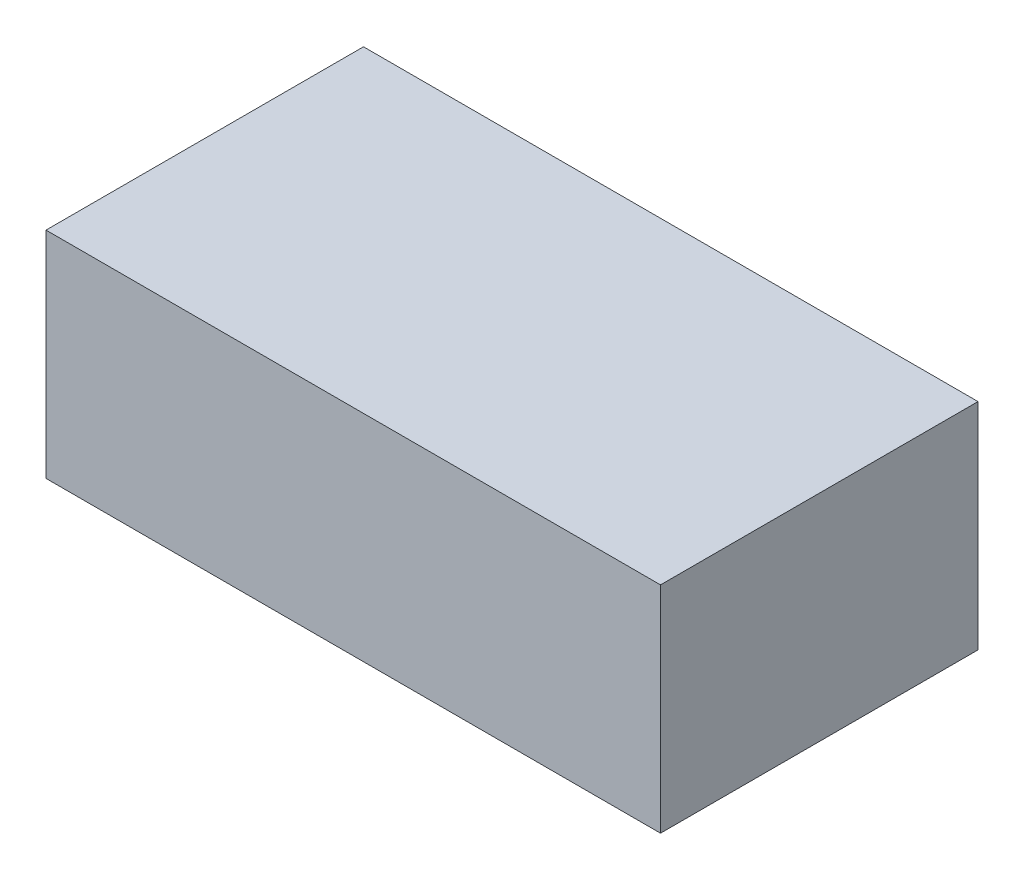
ISO-10303-21;
HEADER;
FILE_DESCRIPTION(('STEP AP214'),'2;1');
FILE_NAME('part.step','',(''),(''),'','','');
FILE_SCHEMA(('AUTOMOTIVE_DESIGN { 1 0 10303 214 1 1 1 1 }'));
ENDSEC;
DATA;
#1=APPLICATION_CONTEXT('core data for automotive mechanical design processes');
#2=APPLICATION_PROTOCOL_DEFINITION('international standard','automotive_design',2000,#1);
#3=PRODUCT_CONTEXT('',#1,'mechanical');
#4=PRODUCT('Part','Part','',(#3));
#5=PRODUCT_RELATED_PRODUCT_CATEGORY('part','',(#4));
#6=PRODUCT_DEFINITION_FORMATION('','',#4);
#7=PRODUCT_DEFINITION_CONTEXT('part definition',#1,'design');
#8=PRODUCT_DEFINITION('design','',#6,#7);
#9=PRODUCT_DEFINITION_SHAPE('','',#8);
#10=(LENGTH_UNIT() NAMED_UNIT(*) SI_UNIT(.MILLI.,.METRE.));
#11=(NAMED_UNIT(*) PLANE_ANGLE_UNIT() SI_UNIT($,.RADIAN.));
#12=(NAMED_UNIT(*) SI_UNIT($,.STERADIAN.) SOLID_ANGLE_UNIT());
#13=UNCERTAINTY_MEASURE_WITH_UNIT(LENGTH_MEASURE(1.E-05),#10,'distance_accuracy_value','');
#14=(GEOMETRIC_REPRESENTATION_CONTEXT(3) GLOBAL_UNCERTAINTY_ASSIGNED_CONTEXT((#13)) GLOBAL_UNIT_ASSIGNED_CONTEXT((#10,
#11,#12)) REPRESENTATION_CONTEXT('',''));
#15=CARTESIAN_POINT('',(0.,0.,0.));
#16=DIRECTION('',(0.,0.,1.));
#17=DIRECTION('',(1.,0.,0.));
#18=AXIS2_PLACEMENT_3D('',#15,#16,#17);
#19=CARTESIAN_POINT('',(0.,20.99999991,0.));
#20=DIRECTION('',(1.,0.,0.));
#21=DIRECTION('',(0.,0.,-1.));
#22=AXIS2_PLACEMENT_3D('',#19,#20,#21);
#23=PLANE('',#22);
#24=DIRECTION('',(0.,0.,1.));
#25=VECTOR('',#24,1.);
#26=CARTESIAN_POINT('',(0.,0.,0.));
#27=LINE('',#26,#25);
#28=CARTESIAN_POINT('',(0.,0.,-31.000100052));
#29=VERTEX_POINT('',#28);
#30=CARTESIAN_POINT('',(0.,0.,0.));
#31=VERTEX_POINT('',#30);
#32=EDGE_CURVE('E96',#29,#31,#27,.T.);
#33=ORIENTED_EDGE('',*,*,#32,.T.);
#34=DIRECTION('',(0.,-1.,0.));
#35=VECTOR('',#34,1.);
#36=CARTESIAN_POINT('',(0.,20.99999991,0.));
#37=LINE('',#36,#35);
#38=CARTESIAN_POINT('',(0.,20.99999991,0.));
#39=VERTEX_POINT('',#38);
#40=EDGE_CURVE('E11',#39,#31,#37,.T.);
#41=ORIENTED_EDGE('',*,*,#40,.F.);
#42=DIRECTION('',(0.,0.,1.));
#43=VECTOR('',#42,1.);
#44=CARTESIAN_POINT('',(0.,20.99999991,0.));
#45=LINE('',#44,#43);
#46=CARTESIAN_POINT('',(0.,20.99999991,-31.000100052));
#47=VERTEX_POINT('',#46);
#48=EDGE_CURVE('E84',#47,#39,#45,.T.);
#49=ORIENTED_EDGE('',*,*,#48,.F.);
#50=DIRECTION('',(0.,-1.,0.));
#51=VECTOR('',#50,1.);
#52=CARTESIAN_POINT('',(0.,20.99999991,-31.000100052));
#53=LINE('',#52,#51);
#54=EDGE_CURVE('E92',#47,#29,#53,.T.);
#55=ORIENTED_EDGE('',*,*,#54,.T.);
#56=EDGE_LOOP('',(#33,#41,#49,#55));
#57=FACE_BOUND('',#56,.T.);
#58=ADVANCED_FACE('F33',(#57),#23,.F.);
#59=CARTESIAN_POINT('',(0.,20.99999991,0.));
#60=DIRECTION('',(0.,0.,-1.));
#61=DIRECTION('',(-1.,0.,0.));
#62=AXIS2_PLACEMENT_3D('',#59,#60,#61);
#63=PLANE('',#62);
#64=DIRECTION('',(1.,0.,0.));
#65=VECTOR('',#64,1.);
#66=CARTESIAN_POINT('',(0.,0.,0.));
#67=LINE('',#66,#65);
#68=CARTESIAN_POINT('',(59.999999888,0.,0.));
#69=VERTEX_POINT('',#68);
#70=EDGE_CURVE('E88',#31,#69,#67,.T.);
#71=ORIENTED_EDGE('',*,*,#70,.T.);
#72=DIRECTION('',(0.,-1.,0.));
#73=VECTOR('',#72,1.);
#74=CARTESIAN_POINT('',(59.999999888,20.99999991,0.));
#75=LINE('',#74,#73);
#76=CARTESIAN_POINT('',(59.999999888,20.99999991,0.));
#77=VERTEX_POINT('',#76);
#78=EDGE_CURVE('E41',#77,#69,#75,.T.);
#79=ORIENTED_EDGE('',*,*,#78,.F.);
#80=DIRECTION('',(1.,0.,0.));
#81=VECTOR('',#80,1.);
#82=CARTESIAN_POINT('',(0.,20.99999991,0.));
#83=LINE('',#82,#81);
#84=EDGE_CURVE('E79',#39,#77,#83,.T.);
#85=ORIENTED_EDGE('',*,*,#84,.F.);
#86=ORIENTED_EDGE('',*,*,#40,.T.);
#87=EDGE_LOOP('',(#71,#79,#85,#86));
#88=FACE_BOUND('',#87,.T.);
#89=ADVANCED_FACE('F87',(#88),#63,.F.);
#90=CARTESIAN_POINT('',(59.999999888,20.99999991,0.));
#91=DIRECTION('',(-1.,0.,0.));
#92=DIRECTION('',(0.,0.,1.));
#93=AXIS2_PLACEMENT_3D('',#90,#91,#92);
#94=PLANE('',#93);
#95=DIRECTION('',(0.,0.,-1.));
#96=VECTOR('',#95,1.);
#97=CARTESIAN_POINT('',(59.999999888,0.,0.));
#98=LINE('',#97,#96);
#99=CARTESIAN_POINT('',(59.999999888,0.,-31.000100052));
#100=VERTEX_POINT('',#99);
#101=EDGE_CURVE('E66',#69,#100,#98,.T.);
#102=ORIENTED_EDGE('',*,*,#101,.T.);
#103=DIRECTION('',(0.,-1.,0.));
#104=VECTOR('',#103,1.);
#105=CARTESIAN_POINT('',(59.999999888,20.99999991,-31.000100052));
#106=LINE('',#105,#104);
#107=CARTESIAN_POINT('',(59.999999888,20.99999991,-31.000100052));
#108=VERTEX_POINT('',#107);
#109=EDGE_CURVE('E89',#108,#100,#106,.T.);
#110=ORIENTED_EDGE('',*,*,#109,.F.);
#111=DIRECTION('',(0.,0.,-1.));
#112=VECTOR('',#111,1.);
#113=CARTESIAN_POINT('',(59.999999888,20.99999991,0.));
#114=LINE('',#113,#112);
#115=EDGE_CURVE('E82',#77,#108,#114,.T.);
#116=ORIENTED_EDGE('',*,*,#115,.F.);
#117=ORIENTED_EDGE('',*,*,#78,.T.);
#118=EDGE_LOOP('',(#102,#110,#116,#117));
#119=FACE_BOUND('',#118,.T.);
#120=ADVANCED_FACE('F90',(#119),#94,.F.);
#121=CARTESIAN_POINT('',(0.,20.99999991,-31.000100052));
#122=DIRECTION('',(0.,0.,1.));
#123=DIRECTION('',(1.,0.,0.));
#124=AXIS2_PLACEMENT_3D('',#121,#122,#123);
#125=PLANE('',#124);
#126=DIRECTION('',(-1.,0.,0.));
#127=VECTOR('',#126,1.);
#128=CARTESIAN_POINT('',(0.,0.,-31.000100052));
#129=LINE('',#128,#127);
#130=EDGE_CURVE('E72',#100,#29,#129,.T.);
#131=ORIENTED_EDGE('',*,*,#130,.T.);
#132=ORIENTED_EDGE('',*,*,#54,.F.);
#133=DIRECTION('',(-1.,0.,0.));
#134=VECTOR('',#133,1.);
#135=CARTESIAN_POINT('',(0.,20.99999991,-31.000100052));
#136=LINE('',#135,#134);
#137=EDGE_CURVE('E49',#108,#47,#136,.T.);
#138=ORIENTED_EDGE('',*,*,#137,.F.);
#139=ORIENTED_EDGE('',*,*,#109,.T.);
#140=EDGE_LOOP('',(#131,#132,#138,#139));
#141=FACE_BOUND('',#140,.T.);
#142=ADVANCED_FACE('F103',(#141),#125,.F.);
#143=CARTESIAN_POINT('',(0.,20.99999991,0.));
#144=DIRECTION('',(0.,-1.,0.));
#145=DIRECTION('',(0.,0.,-1.));
#146=AXIS2_PLACEMENT_3D('',#143,#144,#145);
#147=PLANE('',#146);
#148=ORIENTED_EDGE('',*,*,#48,.T.);
#149=ORIENTED_EDGE('',*,*,#84,.T.);
#150=ORIENTED_EDGE('',*,*,#115,.T.);
#151=ORIENTED_EDGE('',*,*,#137,.T.);
#152=EDGE_LOOP('',(#148,#149,#150,#151));
#153=FACE_BOUND('',#152,.T.);
#154=ADVANCED_FACE('F80',(#153),#147,.F.);
#155=CARTESIAN_POINT('',(0.,0.,0.));
#156=DIRECTION('',(0.,-1.,0.));
#157=DIRECTION('',(0.,0.,-1.));
#158=AXIS2_PLACEMENT_3D('',#155,#156,#157);
#159=PLANE('',#158);
#160=ORIENTED_EDGE('',*,*,#32,.F.);
#161=ORIENTED_EDGE('',*,*,#130,.F.);
#162=ORIENTED_EDGE('',*,*,#101,.F.);
#163=ORIENTED_EDGE('',*,*,#70,.F.);
#164=EDGE_LOOP('',(#160,#161,#162,#163));
#165=FACE_BOUND('',#164,.T.);
#166=ADVANCED_FACE('F106',(#165),#159,.T.);
#167=CLOSED_SHELL('',(#58,#89,#120,#142,#154,#166));
#168=MANIFOLD_SOLID_BREP('B2',#167);
#169=ADVANCED_BREP_SHAPE_REPRESENTATION('',(#18,#168),#14);
#170=SHAPE_DEFINITION_REPRESENTATION(#9,#169);
ENDSEC;
END-ISO-10303-21;
